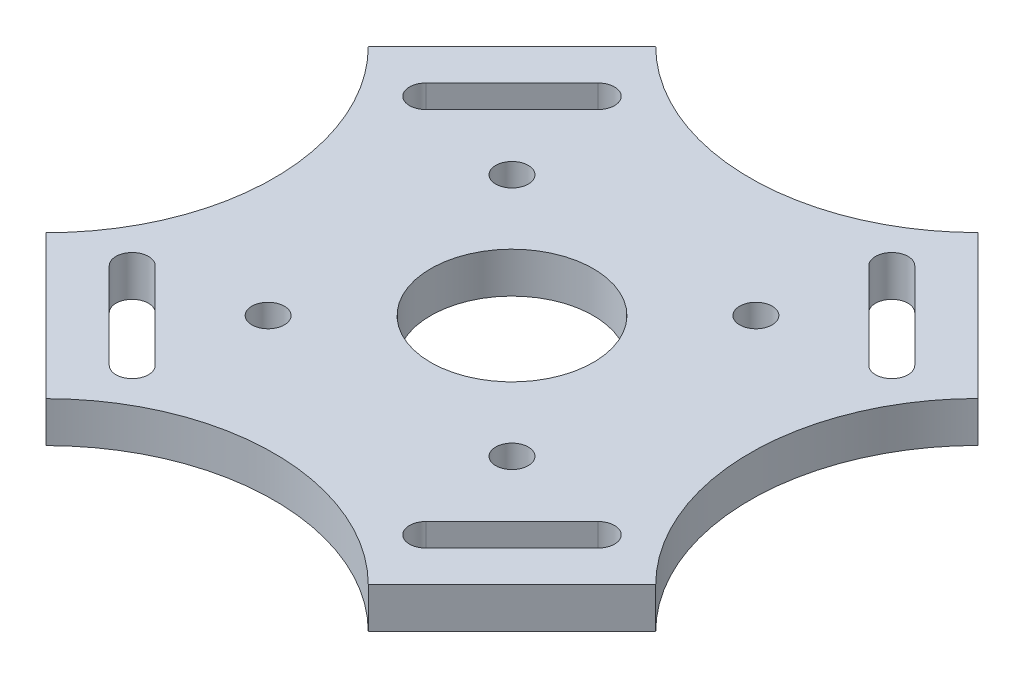
ISO-10303-21;
HEADER;
FILE_DESCRIPTION(('STEP AP214'),'2;1');
FILE_NAME('part.step','',(''),(''),'','','');
FILE_SCHEMA(('AUTOMOTIVE_DESIGN { 1 0 10303 214 1 1 1 1 }'));
ENDSEC;
DATA;
#1=APPLICATION_CONTEXT('core data for automotive mechanical design processes');
#2=APPLICATION_PROTOCOL_DEFINITION('international standard','automotive_design',2000,#1);
#3=PRODUCT_CONTEXT('',#1,'mechanical');
#4=PRODUCT('Part','Part','',(#3));
#5=PRODUCT_RELATED_PRODUCT_CATEGORY('part','',(#4));
#6=PRODUCT_DEFINITION_FORMATION('','',#4);
#7=PRODUCT_DEFINITION_CONTEXT('part definition',#1,'design');
#8=PRODUCT_DEFINITION('design','',#6,#7);
#9=PRODUCT_DEFINITION_SHAPE('','',#8);
#10=(LENGTH_UNIT() NAMED_UNIT(*) SI_UNIT(.MILLI.,.METRE.));
#11=(NAMED_UNIT(*) PLANE_ANGLE_UNIT() SI_UNIT($,.RADIAN.));
#12=(NAMED_UNIT(*) SI_UNIT($,.STERADIAN.) SOLID_ANGLE_UNIT());
#13=UNCERTAINTY_MEASURE_WITH_UNIT(LENGTH_MEASURE(1.E-05),#10,'distance_accuracy_value','');
#14=(GEOMETRIC_REPRESENTATION_CONTEXT(3) GLOBAL_UNCERTAINTY_ASSIGNED_CONTEXT((#13)) GLOBAL_UNIT_ASSIGNED_CONTEXT((#10,
#11,#12)) REPRESENTATION_CONTEXT('',''));
#15=CARTESIAN_POINT('',(0.,0.,0.));
#16=DIRECTION('',(0.,0.,1.));
#17=DIRECTION('',(1.,0.,0.));
#18=AXIS2_PLACEMENT_3D('',#15,#16,#17);
#19=CARTESIAN_POINT('',(-1.03812837674382,5.,-61.3756515884704));
#20=DIRECTION('',(0.,1.,0.));
#21=DIRECTION('',(0.,0.,1.));
#22=AXIS2_PLACEMENT_3D('',#19,#20,#21);
#23=PLANE('',#22);
#24=CARTESIAN_POINT('',(13.9618716232563,5.,-19.0533211181344));
#25=DIRECTION('',(0.,1.,0.));
#26=DIRECTION('',(0.,0.,1.));
#27=AXIS2_PLACEMENT_3D('',#24,#25,#26);
#28=CIRCLE('',#27,2.);
#29=CARTESIAN_POINT('',(13.9618716232563,5.,-17.0533211181344));
#30=VERTEX_POINT('',#29);
#31=EDGE_CURVE('E637',#30,#30,#28,.T.);
#32=ORIENTED_EDGE('',*,*,#31,.F.);
#33=EDGE_LOOP('',(#32));
#34=FACE_BOUND('',#33,.T.);
#35=CARTESIAN_POINT('',(-16.0381283767437,5.,-19.0533211181344));
#36=DIRECTION('',(0.,1.,0.));
#37=DIRECTION('',(0.,0.,1.));
#38=AXIS2_PLACEMENT_3D('',#35,#36,#37);
#39=CIRCLE('',#38,2.);
#40=CARTESIAN_POINT('',(-16.0381283767437,5.,-17.0533211181344));
#41=VERTEX_POINT('',#40);
#42=EDGE_CURVE('E236',#41,#41,#39,.T.);
#43=ORIENTED_EDGE('',*,*,#42,.F.);
#44=EDGE_LOOP('',(#43));
#45=FACE_BOUND('',#44,.T.);
#46=DIRECTION('',(-0.707106781186547,0.,0.707106781186548));
#47=VECTOR('',#46,1.);
#48=CARTESIAN_POINT('',(-20.5069054564814,5.,-34.1286999156747));
#49=LINE('',#48,#47);
#50=CARTESIAN_POINT('',(-20.5069054564814,5.,-34.1286999156747));
#51=VERTEX_POINT('',#50);
#52=CARTESIAN_POINT('',(-31.1135071742797,5.,-23.5220981978765));
#53=VERTEX_POINT('',#52);
#54=EDGE_CURVE('E349',#51,#53,#49,.T.);
#55=ORIENTED_EDGE('',*,*,#54,.F.);
#56=CARTESIAN_POINT('',(-19.0926918941084,5.,-32.7144863533016));
#57=DIRECTION('',(0.,1.,0.));
#58=DIRECTION('',(0.,0.,1.));
#59=AXIS2_PLACEMENT_3D('',#56,#57,#58);
#60=CIRCLE('',#59,2.00000000000001);
#61=CARTESIAN_POINT('',(-17.6784783317352,5.,-31.3002727909285));
#62=VERTEX_POINT('',#61);
#63=EDGE_CURVE('E346',#62,#51,#60,.T.);
#64=ORIENTED_EDGE('',*,*,#63,.F.);
#65=DIRECTION('',(0.707106781186547,0.,-0.707106781186548));
#66=VECTOR('',#65,1.);
#67=CARTESIAN_POINT('',(-17.6784783317352,5.,-31.3002727909285));
#68=LINE('',#67,#66);
#69=CARTESIAN_POINT('',(-28.2850800495335,5.,-20.6936710731303));
#70=VERTEX_POINT('',#69);
#71=EDGE_CURVE('E357',#70,#62,#68,.T.);
#72=ORIENTED_EDGE('',*,*,#71,.F.);
#73=CARTESIAN_POINT('',(-29.6992936119066,5.,-22.1078846355034));
#74=DIRECTION('',(0.,1.,0.));
#75=DIRECTION('',(0.,0.,1.));
#76=AXIS2_PLACEMENT_3D('',#73,#74,#75);
#77=CIRCLE('',#76,2.00000000000001);
#78=EDGE_CURVE('E353',#53,#70,#77,.T.);
#79=ORIENTED_EDGE('',*,*,#78,.F.);
#80=EDGE_LOOP('',(#55,#64,#72,#79));
#81=FACE_BOUND('',#80,.T.);
#82=CARTESIAN_POINT('',(-1.03812837674382,5.,-61.3756515884704));
#83=DIRECTION('',(0.,-1.,0.));
#84=DIRECTION('',(0.,0.,1.));
#85=AXIS2_PLACEMENT_3D('',#82,#83,#84);
#86=CIRCLE('',#85,28.0330085889877);
#87=CARTESIAN_POINT('',(18.7842020935914,5.,-41.5533211181378));
#88=VERTEX_POINT('',#87);
#89=CARTESIAN_POINT('',(-20.8604588470747,5.,-41.5533211181334));
#90=VERTEX_POINT('',#89);
#91=EDGE_CURVE('E389',#88,#90,#86,.T.);
#92=ORIENTED_EDGE('',*,*,#91,.T.);
#93=DIRECTION('',(-0.707106781186548,0.,0.707106781186547));
#94=VECTOR('',#93,1.);
#95=CARTESIAN_POINT('',(-38.5381283767384,5.,-23.8756515884697));
#96=LINE('',#95,#94);
#97=CARTESIAN_POINT('',(-38.5381283767384,5.,-23.8756515884697));
#98=VERTEX_POINT('',#97);
#99=EDGE_CURVE('E393',#90,#98,#96,.T.);
#100=ORIENTED_EDGE('',*,*,#99,.T.);
#101=CARTESIAN_POINT('',(-58.3441734218173,5.,-4.03704906150618));
#102=DIRECTION('',(0.,-1.,0.));
#103=DIRECTION('',(0.,0.,1.));
#104=AXIS2_PLACEMENT_3D('',#101,#102,#103);
#105=CIRCLE('',#104,28.0330085889927);
#106=CARTESIAN_POINT('',(-38.5218429514813,5.,15.7852814088328));
#107=VERTEX_POINT('',#106);
#108=EDGE_CURVE('E397',#98,#107,#105,.T.);
#109=ORIENTED_EDGE('',*,*,#108,.T.);
#110=DIRECTION('',(0.707106781186548,0.,0.707106781186547));
#111=VECTOR('',#110,1.);
#112=CARTESIAN_POINT('',(-20.8441734218177,5.,33.4629509384965));
#113=LINE('',#112,#111);
#114=CARTESIAN_POINT('',(-20.8441734218177,5.,33.4629509384965));
#115=VERTEX_POINT('',#114);
#116=EDGE_CURVE('E400',#107,#115,#113,.T.);
#117=ORIENTED_EDGE('',*,*,#116,.T.);
#118=CARTESIAN_POINT('',(-1.02184295148293,5.,53.2852814088336));
#119=DIRECTION('',(0.,-1.,0.));
#120=DIRECTION('',(0.,0.,-1.));
#121=AXIS2_PLACEMENT_3D('',#118,#119,#120);
#122=CIRCLE('',#121,28.0330085889906);
#123=CARTESIAN_POINT('',(18.7842020935875,5.,33.4466788818645));
#124=VERTEX_POINT('',#123);
#125=EDGE_CURVE('E403',#115,#124,#122,.T.);
#126=ORIENTED_EDGE('',*,*,#125,.T.);
#127=DIRECTION('',(0.70710678118655,0.,-0.707106781186546));
#128=VECTOR('',#127,1.);
#129=CARTESIAN_POINT('',(36.4618716232511,5.,15.7690093522009));
#130=LINE('',#129,#128);
#131=CARTESIAN_POINT('',(36.4618716232511,5.,15.7690093522009));
#132=VERTEX_POINT('',#131);
#133=EDGE_CURVE('E406',#124,#132,#130,.T.);
#134=ORIENTED_EDGE('',*,*,#133,.T.);
#135=CARTESIAN_POINT('',(56.2842020935884,5.,-4.05332111812981));
#136=DIRECTION('',(0.,-1.,0.));
#137=DIRECTION('',(0.,0.,1.));
#138=AXIS2_PLACEMENT_3D('',#135,#136,#137);
#139=CIRCLE('',#138,28.0330085889878);
#140=CARTESIAN_POINT('',(36.4618716232599,5.,-23.8756515884693));
#141=VERTEX_POINT('',#140);
#142=EDGE_CURVE('E409',#132,#141,#139,.T.);
#143=ORIENTED_EDGE('',*,*,#142,.T.);
#144=DIRECTION('',(-0.707106781186548,0.,-0.707106781186547));
#145=VECTOR('',#144,1.);
#146=CARTESIAN_POINT('',(18.7842020935914,5.,-41.5533211181378));
#147=LINE('',#146,#145);
#148=EDGE_CURVE('E412',#141,#88,#147,.T.);
#149=ORIENTED_EDGE('',*,*,#148,.T.);
#150=EDGE_LOOP('',(#92,#100,#109,#117,#126,#134,#143,#149));
#151=FACE_BOUND('',#150,.T.);
#152=CARTESIAN_POINT('',(-1.03812837674365,5.,-4.0533211181344));
#153=DIRECTION('',(0.,1.,0.));
#154=DIRECTION('',(0.,0.,1.));
#155=AXIS2_PLACEMENT_3D('',#152,#153,#154);
#156=CIRCLE('',#155,10.);
#157=CARTESIAN_POINT('',(-1.03812837674365,5.,5.9466788818656));
#158=VERTEX_POINT('',#157);
#159=EDGE_CURVE('E338',#158,#158,#156,.T.);
#160=ORIENTED_EDGE('',*,*,#159,.F.);
#161=EDGE_LOOP('',(#160));
#162=FACE_BOUND('',#161,.T.);
#163=DIRECTION('',(-0.707106781186545,0.,-0.70710678118655));
#164=VECTOR('',#163,1.);
#165=CARTESIAN_POINT('',(29.0372504207969,5.,-23.5220981978727));
#166=LINE('',#165,#164);
#167=CARTESIAN_POINT('',(29.0372504207969,5.,-23.5220981978727));
#168=VERTEX_POINT('',#167);
#169=CARTESIAN_POINT('',(18.4306487029987,5.,-34.128699915671));
#170=VERTEX_POINT('',#169);
#171=EDGE_CURVE('E298',#168,#170,#166,.T.);
#172=ORIENTED_EDGE('',*,*,#171,.F.);
#173=CARTESIAN_POINT('',(27.6230368584237,5.,-22.1078846354996));
#174=DIRECTION('',(0.,1.,0.));
#175=DIRECTION('',(0.,0.,1.));
#176=AXIS2_PLACEMENT_3D('',#173,#174,#175);
#177=CIRCLE('',#176,2.);
#178=CARTESIAN_POINT('',(26.2088232960507,5.,-20.6936710731265));
#179=VERTEX_POINT('',#178);
#180=EDGE_CURVE('E295',#179,#168,#177,.T.);
#181=ORIENTED_EDGE('',*,*,#180,.F.);
#182=DIRECTION('',(0.707106781186545,0.,0.70710678118655));
#183=VECTOR('',#182,1.);
#184=CARTESIAN_POINT('',(26.2088232960507,5.,-20.6936710731265));
#185=LINE('',#184,#183);
#186=CARTESIAN_POINT('',(15.6022215782525,5.,-31.3002727909248));
#187=VERTEX_POINT('',#186);
#188=EDGE_CURVE('E306',#187,#179,#185,.T.);
#189=ORIENTED_EDGE('',*,*,#188,.F.);
#190=CARTESIAN_POINT('',(17.0164351406256,5.,-32.7144863532979));
#191=DIRECTION('',(0.,1.,0.));
#192=DIRECTION('',(0.,0.,1.));
#193=AXIS2_PLACEMENT_3D('',#190,#191,#192);
#194=CIRCLE('',#193,2.00000000000001);
#195=EDGE_CURVE('E302',#170,#187,#194,.T.);
#196=ORIENTED_EDGE('',*,*,#195,.F.);
#197=EDGE_LOOP('',(#172,#181,#189,#196));
#198=FACE_BOUND('',#197,.T.);
#199=DIRECTION('',(0.707106781186552,0.,-0.707106781186543));
#200=VECTOR('',#199,1.);
#201=CARTESIAN_POINT('',(18.4306487029947,5.,26.0220576794056));
#202=LINE('',#201,#200);
#203=CARTESIAN_POINT('',(18.4306487029947,5.,26.0220576794056));
#204=VERTEX_POINT('',#203);
#205=CARTESIAN_POINT('',(29.037250420793,5.,15.4154559616074));
#206=VERTEX_POINT('',#205);
#207=EDGE_CURVE('E255',#204,#206,#202,.T.);
#208=ORIENTED_EDGE('',*,*,#207,.F.);
#209=CARTESIAN_POINT('',(17.0164351406216,5.,24.6078441170324));
#210=DIRECTION('',(0.,1.,0.));
#211=DIRECTION('',(0.,0.,1.));
#212=AXIS2_PLACEMENT_3D('',#209,#210,#211);
#213=CIRCLE('',#212,2.00000000000001);
#214=CARTESIAN_POINT('',(15.6022215782485,5.,23.1936305546594));
#215=VERTEX_POINT('',#214);
#216=EDGE_CURVE('E252',#215,#204,#213,.T.);
#217=ORIENTED_EDGE('',*,*,#216,.F.);
#218=DIRECTION('',(-0.707106781186552,0.,0.707106781186543));
#219=VECTOR('',#218,1.);
#220=CARTESIAN_POINT('',(15.6022215782485,5.,23.1936305546594));
#221=LINE('',#220,#219);
#222=CARTESIAN_POINT('',(26.2088232960468,5.,12.5870288368612));
#223=VERTEX_POINT('',#222);
#224=EDGE_CURVE('E263',#223,#215,#221,.T.);
#225=ORIENTED_EDGE('',*,*,#224,.F.);
#226=CARTESIAN_POINT('',(27.6230368584199,5.,14.0012423992343));
#227=DIRECTION('',(0.,1.,0.));
#228=DIRECTION('',(0.,0.,1.));
#229=AXIS2_PLACEMENT_3D('',#226,#227,#228);
#230=CIRCLE('',#229,2.00000000000001);
#231=EDGE_CURVE('E259',#206,#223,#230,.T.);
#232=ORIENTED_EDGE('',*,*,#231,.F.);
#233=EDGE_LOOP('',(#208,#217,#225,#232));
#234=FACE_BOUND('',#233,.T.);
#235=DIRECTION('',(0.70710678118654,0.,0.707106781186555));
#236=VECTOR('',#235,1.);
#237=CARTESIAN_POINT('',(-31.1135071742835,5.,15.4154559616032));
#238=LINE('',#237,#236);
#239=CARTESIAN_POINT('',(-31.1135071742835,5.,15.4154559616032));
#240=VERTEX_POINT('',#239);
#241=CARTESIAN_POINT('',(-20.5069054564854,5.,26.0220576794016));
#242=VERTEX_POINT('',#241);
#243=EDGE_CURVE('E210',#240,#242,#238,.T.);
#244=ORIENTED_EDGE('',*,*,#243,.F.);
#245=CARTESIAN_POINT('',(-29.6992936119104,5.,14.0012423992302));
#246=DIRECTION('',(0.,1.,0.));
#247=DIRECTION('',(0.,0.,1.));
#248=AXIS2_PLACEMENT_3D('',#245,#246,#247);
#249=CIRCLE('',#248,2.);
#250=CARTESIAN_POINT('',(-28.2850800495373,5.,12.5870288368571));
#251=VERTEX_POINT('',#250);
#252=EDGE_CURVE('E201',#251,#240,#249,.T.);
#253=ORIENTED_EDGE('',*,*,#252,.F.);
#254=DIRECTION('',(-0.70710678118654,0.,-0.707106781186555));
#255=VECTOR('',#254,1.);
#256=CARTESIAN_POINT('',(-28.2850800495373,5.,12.5870288368571));
#257=LINE('',#256,#255);
#258=CARTESIAN_POINT('',(-17.6784783317392,5.,23.1936305546554));
#259=VERTEX_POINT('',#258);
#260=EDGE_CURVE('E228',#259,#251,#257,.T.);
#261=ORIENTED_EDGE('',*,*,#260,.F.);
#262=CARTESIAN_POINT('',(-19.0926918941123,5.,24.6078441170285));
#263=DIRECTION('',(0.,1.,0.));
#264=DIRECTION('',(0.,0.,1.));
#265=AXIS2_PLACEMENT_3D('',#262,#263,#264);
#266=CIRCLE('',#265,2.00000000000001);
#267=EDGE_CURVE('E224',#242,#259,#266,.T.);
#268=ORIENTED_EDGE('',*,*,#267,.F.);
#269=EDGE_LOOP('',(#244,#253,#261,#268));
#270=FACE_BOUND('',#269,.T.);
#271=CARTESIAN_POINT('',(13.9618716232563,5.,10.9466788818656));
#272=DIRECTION('',(0.,1.,0.));
#273=DIRECTION('',(0.,0.,1.));
#274=AXIS2_PLACEMENT_3D('',#271,#272,#273);
#275=CIRCLE('',#274,2.);
#276=CARTESIAN_POINT('',(13.9618716232563,5.,12.9466788818656));
#277=VERTEX_POINT('',#276);
#278=EDGE_CURVE('E645',#277,#277,#275,.T.);
#279=ORIENTED_EDGE('',*,*,#278,.F.);
#280=EDGE_LOOP('',(#279));
#281=FACE_BOUND('',#280,.T.);
#282=CARTESIAN_POINT('',(-16.0381283767437,5.,10.9466788818656));
#283=DIRECTION('',(0.,1.,0.));
#284=DIRECTION('',(0.,0.,1.));
#285=AXIS2_PLACEMENT_3D('',#282,#283,#284);
#286=CIRCLE('',#285,2.);
#287=CARTESIAN_POINT('',(-16.0381283767437,5.,12.9466788818656));
#288=VERTEX_POINT('',#287);
#289=EDGE_CURVE('E626',#288,#288,#286,.T.);
#290=ORIENTED_EDGE('',*,*,#289,.F.);
#291=EDGE_LOOP('',(#290));
#292=FACE_BOUND('',#291,.T.);
#293=ADVANCED_FACE('F39',(#34,#45,#81,#151,#162,#198,#234,#270,#281,#292),#23,.T.);
#294=CARTESIAN_POINT('',(-1.03812837674382,0.,-61.3756515884704));
#295=DIRECTION('',(0.,1.,0.));
#296=DIRECTION('',(0.,0.,1.));
#297=AXIS2_PLACEMENT_3D('',#294,#295,#296);
#298=PLANE('',#297);
#299=CARTESIAN_POINT('',(17.0164351406216,0.,24.6078441170324));
#300=DIRECTION('',(0.,1.,0.));
#301=DIRECTION('',(0.,0.,1.));
#302=AXIS2_PLACEMENT_3D('',#299,#300,#301);
#303=CIRCLE('',#302,2.00000000000001);
#304=CARTESIAN_POINT('',(15.6022215782485,0.,23.1936305546593));
#305=VERTEX_POINT('',#304);
#306=CARTESIAN_POINT('',(18.4306487029947,0.,26.0220576794056));
#307=VERTEX_POINT('',#306);
#308=EDGE_CURVE('E219',#305,#307,#303,.T.);
#309=ORIENTED_EDGE('',*,*,#308,.T.);
#310=DIRECTION('',(0.707106781186552,0.,-0.707106781186543));
#311=VECTOR('',#310,1.);
#312=CARTESIAN_POINT('',(18.4306487029947,0.,26.0220576794056));
#313=LINE('',#312,#311);
#314=CARTESIAN_POINT('',(29.037250420793,0.,15.4154559616074));
#315=VERTEX_POINT('',#314);
#316=EDGE_CURVE('E270',#307,#315,#313,.T.);
#317=ORIENTED_EDGE('',*,*,#316,.T.);
#318=CARTESIAN_POINT('',(27.6230368584199,0.,14.0012423992343));
#319=DIRECTION('',(0.,1.,0.));
#320=DIRECTION('',(0.,0.,1.));
#321=AXIS2_PLACEMENT_3D('',#318,#319,#320);
#322=CIRCLE('',#321,2.00000000000001);
#323=CARTESIAN_POINT('',(26.2088232960468,0.,12.5870288368612));
#324=VERTEX_POINT('',#323);
#325=EDGE_CURVE('E274',#315,#324,#322,.T.);
#326=ORIENTED_EDGE('',*,*,#325,.T.);
#327=DIRECTION('',(-0.707106781186552,0.,0.707106781186543));
#328=VECTOR('',#327,1.);
#329=CARTESIAN_POINT('',(15.6022215782485,0.,23.1936305546594));
#330=LINE('',#329,#328);
#331=EDGE_CURVE('E256',#324,#305,#330,.T.);
#332=ORIENTED_EDGE('',*,*,#331,.T.);
#333=EDGE_LOOP('',(#309,#317,#326,#332));
#334=FACE_BOUND('',#333,.T.);
#335=CARTESIAN_POINT('',(-1.03812837674365,0.,-4.0533211181344));
#336=DIRECTION('',(0.,1.,0.));
#337=DIRECTION('',(0.,0.,1.));
#338=AXIS2_PLACEMENT_3D('',#335,#336,#337);
#339=CIRCLE('',#338,10.);
#340=CARTESIAN_POINT('',(-1.03812837674365,0.,5.9466788818656));
#341=VERTEX_POINT('',#340);
#342=EDGE_CURVE('E337',#341,#341,#339,.T.);
#343=ORIENTED_EDGE('',*,*,#342,.T.);
#344=EDGE_LOOP('',(#343));
#345=FACE_BOUND('',#344,.T.);
#346=CARTESIAN_POINT('',(-19.0926918941084,0.,-32.7144863533016));
#347=DIRECTION('',(0.,1.,0.));
#348=DIRECTION('',(0.,0.,1.));
#349=AXIS2_PLACEMENT_3D('',#346,#347,#348);
#350=CIRCLE('',#349,2.00000000000001);
#351=CARTESIAN_POINT('',(-17.6784783317352,0.,-31.3002727909285));
#352=VERTEX_POINT('',#351);
#353=CARTESIAN_POINT('',(-20.5069054564814,0.,-34.1286999156747));
#354=VERTEX_POINT('',#353);
#355=EDGE_CURVE('E342',#352,#354,#350,.T.);
#356=ORIENTED_EDGE('',*,*,#355,.T.);
#357=DIRECTION('',(-0.707106781186547,0.,0.707106781186548));
#358=VECTOR('',#357,1.);
#359=CARTESIAN_POINT('',(-20.5069054564814,0.,-34.1286999156747));
#360=LINE('',#359,#358);
#361=CARTESIAN_POINT('',(-31.1135071742797,0.,-23.5220981978765));
#362=VERTEX_POINT('',#361);
#363=EDGE_CURVE('E364',#354,#362,#360,.T.);
#364=ORIENTED_EDGE('',*,*,#363,.T.);
#365=CARTESIAN_POINT('',(-29.6992936119066,0.,-22.1078846355034));
#366=DIRECTION('',(0.,1.,0.));
#367=DIRECTION('',(0.,0.,1.));
#368=AXIS2_PLACEMENT_3D('',#365,#366,#367);
#369=CIRCLE('',#368,2.00000000000001);
#370=CARTESIAN_POINT('',(-28.2850800495335,0.,-20.6936710731303));
#371=VERTEX_POINT('',#370);
#372=EDGE_CURVE('E368',#362,#371,#369,.T.);
#373=ORIENTED_EDGE('',*,*,#372,.T.);
#374=DIRECTION('',(0.707106781186547,0.,-0.707106781186548));
#375=VECTOR('',#374,1.);
#376=CARTESIAN_POINT('',(-17.6784783317352,0.,-31.3002727909285));
#377=LINE('',#376,#375);
#378=EDGE_CURVE('E350',#371,#352,#377,.T.);
#379=ORIENTED_EDGE('',*,*,#378,.T.);
#380=EDGE_LOOP('',(#356,#364,#373,#379));
#381=FACE_BOUND('',#380,.T.);
#382=CARTESIAN_POINT('',(-1.03812837674382,0.,-61.3756515884704));
#383=DIRECTION('',(0.,-1.,0.));
#384=DIRECTION('',(0.,0.,1.));
#385=AXIS2_PLACEMENT_3D('',#382,#383,#384);
#386=CIRCLE('',#385,28.0330085889877);
#387=CARTESIAN_POINT('',(18.7842020935914,0.,-41.5533211181378));
#388=VERTEX_POINT('',#387);
#389=CARTESIAN_POINT('',(-20.8604588470747,0.,-41.5533211181334));
#390=VERTEX_POINT('',#389);
#391=EDGE_CURVE('E388',#388,#390,#386,.T.);
#392=ORIENTED_EDGE('',*,*,#391,.F.);
#393=DIRECTION('',(-0.707106781186548,0.,-0.707106781186547));
#394=VECTOR('',#393,1.);
#395=CARTESIAN_POINT('',(18.7842020935914,0.,-41.5533211181378));
#396=LINE('',#395,#394);
#397=CARTESIAN_POINT('',(36.4618716232599,0.,-23.8756515884693));
#398=VERTEX_POINT('',#397);
#399=EDGE_CURVE('E394',#398,#388,#396,.T.);
#400=ORIENTED_EDGE('',*,*,#399,.F.);
#401=CARTESIAN_POINT('',(56.2842020935884,0.,-4.05332111812981));
#402=DIRECTION('',(0.,-1.,0.));
#403=DIRECTION('',(0.,0.,1.));
#404=AXIS2_PLACEMENT_3D('',#401,#402,#403);
#405=CIRCLE('',#404,28.0330085889878);
#406=CARTESIAN_POINT('',(36.4618716232511,0.,15.7690093522009));
#407=VERTEX_POINT('',#406);
#408=EDGE_CURVE('E434',#407,#398,#405,.T.);
#409=ORIENTED_EDGE('',*,*,#408,.F.);
#410=DIRECTION('',(0.70710678118655,0.,-0.707106781186546));
#411=VECTOR('',#410,1.);
#412=CARTESIAN_POINT('',(36.4618716232511,0.,15.7690093522009));
#413=LINE('',#412,#411);
#414=CARTESIAN_POINT('',(18.7842020935875,0.,33.4466788818645));
#415=VERTEX_POINT('',#414);
#416=EDGE_CURVE('E431',#415,#407,#413,.T.);
#417=ORIENTED_EDGE('',*,*,#416,.F.);
#418=CARTESIAN_POINT('',(-1.02184295148293,0.,53.2852814088336));
#419=DIRECTION('',(0.,-1.,0.));
#420=DIRECTION('',(0.,0.,-1.));
#421=AXIS2_PLACEMENT_3D('',#418,#419,#420);
#422=CIRCLE('',#421,28.0330085889906);
#423=CARTESIAN_POINT('',(-20.8441734218177,0.,33.4629509384965));
#424=VERTEX_POINT('',#423);
#425=EDGE_CURVE('E428',#424,#415,#422,.T.);
#426=ORIENTED_EDGE('',*,*,#425,.F.);
#427=DIRECTION('',(0.707106781186548,0.,0.707106781186547));
#428=VECTOR('',#427,1.);
#429=CARTESIAN_POINT('',(-20.8441734218177,0.,33.4629509384965));
#430=LINE('',#429,#428);
#431=CARTESIAN_POINT('',(-38.5218429514813,0.,15.7852814088328));
#432=VERTEX_POINT('',#431);
#433=EDGE_CURVE('E425',#432,#424,#430,.T.);
#434=ORIENTED_EDGE('',*,*,#433,.F.);
#435=CARTESIAN_POINT('',(-58.3441734218173,0.,-4.03704906150618));
#436=DIRECTION('',(0.,-1.,0.));
#437=DIRECTION('',(0.,0.,1.));
#438=AXIS2_PLACEMENT_3D('',#435,#436,#437);
#439=CIRCLE('',#438,28.0330085889927);
#440=CARTESIAN_POINT('',(-38.5381283767384,0.,-23.8756515884697));
#441=VERTEX_POINT('',#440);
#442=EDGE_CURVE('E422',#441,#432,#439,.T.);
#443=ORIENTED_EDGE('',*,*,#442,.F.);
#444=DIRECTION('',(-0.707106781186548,0.,0.707106781186547));
#445=VECTOR('',#444,1.);
#446=CARTESIAN_POINT('',(-38.5381283767384,0.,-23.8756515884697));
#447=LINE('',#446,#445);
#448=EDGE_CURVE('E419',#390,#441,#447,.T.);
#449=ORIENTED_EDGE('',*,*,#448,.F.);
#450=EDGE_LOOP('',(#392,#400,#409,#417,#426,#434,#443,#449));
#451=FACE_BOUND('',#450,.T.);
#452=CARTESIAN_POINT('',(27.6230368584237,0.,-22.1078846354996));
#453=DIRECTION('',(0.,1.,0.));
#454=DIRECTION('',(0.,0.,1.));
#455=AXIS2_PLACEMENT_3D('',#452,#453,#454);
#456=CIRCLE('',#455,2.);
#457=CARTESIAN_POINT('',(26.2088232960507,0.,-20.6936710731265));
#458=VERTEX_POINT('',#457);
#459=CARTESIAN_POINT('',(29.0372504207969,0.,-23.5220981978727));
#460=VERTEX_POINT('',#459);
#461=EDGE_CURVE('E294',#458,#460,#456,.T.);
#462=ORIENTED_EDGE('',*,*,#461,.T.);
#463=DIRECTION('',(-0.707106781186545,0.,-0.70710678118655));
#464=VECTOR('',#463,1.);
#465=CARTESIAN_POINT('',(29.0372504207969,0.,-23.5220981978727));
#466=LINE('',#465,#464);
#467=CARTESIAN_POINT('',(18.4306487029987,0.,-34.128699915671));
#468=VERTEX_POINT('',#467);
#469=EDGE_CURVE('E313',#460,#468,#466,.T.);
#470=ORIENTED_EDGE('',*,*,#469,.T.);
#471=CARTESIAN_POINT('',(17.0164351406256,0.,-32.7144863532979));
#472=DIRECTION('',(0.,1.,0.));
#473=DIRECTION('',(0.,0.,1.));
#474=AXIS2_PLACEMENT_3D('',#471,#472,#473);
#475=CIRCLE('',#474,2.00000000000001);
#476=CARTESIAN_POINT('',(15.6022215782525,0.,-31.3002727909248));
#477=VERTEX_POINT('',#476);
#478=EDGE_CURVE('E317',#468,#477,#475,.T.);
#479=ORIENTED_EDGE('',*,*,#478,.T.);
#480=DIRECTION('',(0.707106781186545,0.,0.70710678118655));
#481=VECTOR('',#480,1.);
#482=CARTESIAN_POINT('',(26.2088232960507,0.,-20.6936710731265));
#483=LINE('',#482,#481);
#484=EDGE_CURVE('E299',#477,#458,#483,.T.);
#485=ORIENTED_EDGE('',*,*,#484,.T.);
#486=EDGE_LOOP('',(#462,#470,#479,#485));
#487=FACE_BOUND('',#486,.T.);
#488=CARTESIAN_POINT('',(-29.6992936119104,0.,14.0012423992302));
#489=DIRECTION('',(0.,1.,0.));
#490=DIRECTION('',(0.,0.,1.));
#491=AXIS2_PLACEMENT_3D('',#488,#489,#490);
#492=CIRCLE('',#491,2.);
#493=CARTESIAN_POINT('',(-28.2850800495373,0.,12.5870288368571));
#494=VERTEX_POINT('',#493);
#495=CARTESIAN_POINT('',(-31.1135071742835,0.,15.4154559616032));
#496=VERTEX_POINT('',#495);
#497=EDGE_CURVE('E63',#494,#496,#492,.T.);
#498=ORIENTED_EDGE('',*,*,#497,.T.);
#499=DIRECTION('',(0.70710678118654,0.,0.707106781186555));
#500=VECTOR('',#499,1.);
#501=CARTESIAN_POINT('',(-31.1135071742835,0.,15.4154559616032));
#502=LINE('',#501,#500);
#503=CARTESIAN_POINT('',(-20.5069054564854,0.,26.0220576794016));
#504=VERTEX_POINT('',#503);
#505=EDGE_CURVE('E217',#496,#504,#502,.T.);
#506=ORIENTED_EDGE('',*,*,#505,.T.);
#507=CARTESIAN_POINT('',(-19.0926918941123,0.,24.6078441170285));
#508=DIRECTION('',(0.,1.,0.));
#509=DIRECTION('',(0.,0.,1.));
#510=AXIS2_PLACEMENT_3D('',#507,#508,#509);
#511=CIRCLE('',#510,2.00000000000001);
#512=CARTESIAN_POINT('',(-17.6784783317392,0.,23.1936305546554));
#513=VERTEX_POINT('',#512);
#514=EDGE_CURVE('E239',#504,#513,#511,.T.);
#515=ORIENTED_EDGE('',*,*,#514,.T.);
#516=DIRECTION('',(-0.70710678118654,0.,-0.707106781186555));
#517=VECTOR('',#516,1.);
#518=CARTESIAN_POINT('',(-28.2850800495373,0.,12.5870288368571));
#519=LINE('',#518,#517);
#520=EDGE_CURVE('E211',#513,#494,#519,.T.);
#521=ORIENTED_EDGE('',*,*,#520,.T.);
#522=EDGE_LOOP('',(#498,#506,#515,#521));
#523=FACE_BOUND('',#522,.T.);
#524=CARTESIAN_POINT('',(-16.0381283767437,0.,-19.0533211181344));
#525=DIRECTION('',(0.,1.,0.));
#526=DIRECTION('',(0.,0.,1.));
#527=AXIS2_PLACEMENT_3D('',#524,#525,#526);
#528=CIRCLE('',#527,2.);
#529=CARTESIAN_POINT('',(-16.0381283767437,0.,-17.0533211181344));
#530=VERTEX_POINT('',#529);
#531=EDGE_CURVE('E649',#530,#530,#528,.T.);
#532=ORIENTED_EDGE('',*,*,#531,.T.);
#533=EDGE_LOOP('',(#532));
#534=FACE_BOUND('',#533,.T.);
#535=CARTESIAN_POINT('',(13.9618716232563,0.,10.9466788818656));
#536=DIRECTION('',(0.,1.,0.));
#537=DIRECTION('',(0.,0.,1.));
#538=AXIS2_PLACEMENT_3D('',#535,#536,#537);
#539=CIRCLE('',#538,2.);
#540=CARTESIAN_POINT('',(13.9618716232563,0.,12.9466788818656));
#541=VERTEX_POINT('',#540);
#542=EDGE_CURVE('E641',#541,#541,#539,.T.);
#543=ORIENTED_EDGE('',*,*,#542,.T.);
#544=EDGE_LOOP('',(#543));
#545=FACE_BOUND('',#544,.T.);
#546=CARTESIAN_POINT('',(13.9618716232563,0.,-19.0533211181344));
#547=DIRECTION('',(0.,1.,0.));
#548=DIRECTION('',(0.,0.,1.));
#549=AXIS2_PLACEMENT_3D('',#546,#547,#548);
#550=CIRCLE('',#549,2.);
#551=CARTESIAN_POINT('',(13.9618716232563,0.,-17.0533211181344));
#552=VERTEX_POINT('',#551);
#553=EDGE_CURVE('E634',#552,#552,#550,.T.);
#554=ORIENTED_EDGE('',*,*,#553,.T.);
#555=EDGE_LOOP('',(#554));
#556=FACE_BOUND('',#555,.T.);
#557=CARTESIAN_POINT('',(-16.0381283767437,0.,10.9466788818656));
#558=DIRECTION('',(0.,1.,0.));
#559=DIRECTION('',(0.,0.,1.));
#560=AXIS2_PLACEMENT_3D('',#557,#558,#559);
#561=CIRCLE('',#560,2.);
#562=CARTESIAN_POINT('',(-16.0381283767437,0.,12.9466788818656));
#563=VERTEX_POINT('',#562);
#564=EDGE_CURVE('E629',#563,#563,#561,.T.);
#565=ORIENTED_EDGE('',*,*,#564,.T.);
#566=EDGE_LOOP('',(#565));
#567=FACE_BOUND('',#566,.T.);
#568=ADVANCED_FACE('F473',(#334,#345,#381,#451,#487,#523,#534,#545,#556,#567),#298,.F.);
#569=CARTESIAN_POINT('',(-1.03812837674382,5.,-61.3756515884704));
#570=DIRECTION('',(0.,-1.,0.));
#571=DIRECTION('',(0.,0.,-1.));
#572=AXIS2_PLACEMENT_3D('',#569,#570,#571);
#573=CYLINDRICAL_SURFACE('',#572,28.0330085889877);
#574=ORIENTED_EDGE('',*,*,#391,.T.);
#575=DIRECTION('',(0.,-1.,0.));
#576=VECTOR('',#575,1.);
#577=CARTESIAN_POINT('',(-20.8604588470747,5.,-41.5533211181334));
#578=LINE('',#577,#576);
#579=EDGE_CURVE('E11',#90,#390,#578,.T.);
#580=ORIENTED_EDGE('',*,*,#579,.F.);
#581=ORIENTED_EDGE('',*,*,#91,.F.);
#582=DIRECTION('',(0.,-1.,0.));
#583=VECTOR('',#582,1.);
#584=CARTESIAN_POINT('',(18.7842020935914,5.,-41.5533211181378));
#585=LINE('',#584,#583);
#586=EDGE_CURVE('E415',#88,#388,#585,.T.);
#587=ORIENTED_EDGE('',*,*,#586,.T.);
#588=EDGE_LOOP('',(#574,#580,#581,#587));
#589=FACE_BOUND('',#588,.T.);
#590=ADVANCED_FACE('F41',(#589),#573,.F.);
#591=CARTESIAN_POINT('',(-38.5381283767384,5.,-23.8756515884697));
#592=DIRECTION('',(0.707106781186547,0.,0.707106781186548));
#593=DIRECTION('',(0.707106781186548,0.,-0.707106781186547));
#594=AXIS2_PLACEMENT_3D('',#591,#592,#593);
#595=PLANE('',#594);
#596=ORIENTED_EDGE('',*,*,#448,.T.);
#597=DIRECTION('',(0.,-1.,0.));
#598=VECTOR('',#597,1.);
#599=CARTESIAN_POINT('',(-38.5381283767384,5.,-23.8756515884697));
#600=LINE('',#599,#598);
#601=EDGE_CURVE('E48',#98,#441,#600,.T.);
#602=ORIENTED_EDGE('',*,*,#601,.F.);
#603=ORIENTED_EDGE('',*,*,#99,.F.);
#604=ORIENTED_EDGE('',*,*,#579,.T.);
#605=EDGE_LOOP('',(#596,#602,#603,#604));
#606=FACE_BOUND('',#605,.T.);
#607=ADVANCED_FACE('F491',(#606),#595,.F.);
#608=CARTESIAN_POINT('',(-58.3441734218173,5.,-4.03704906150618));
#609=DIRECTION('',(0.,-1.,0.));
#610=DIRECTION('',(0.,0.,-1.));
#611=AXIS2_PLACEMENT_3D('',#608,#609,#610);
#612=CYLINDRICAL_SURFACE('',#611,28.0330085889927);
#613=ORIENTED_EDGE('',*,*,#442,.T.);
#614=DIRECTION('',(0.,-1.,0.));
#615=VECTOR('',#614,1.);
#616=CARTESIAN_POINT('',(-38.5218429514813,5.,15.7852814088328));
#617=LINE('',#616,#615);
#618=EDGE_CURVE('E458',#107,#432,#617,.T.);
#619=ORIENTED_EDGE('',*,*,#618,.F.);
#620=ORIENTED_EDGE('',*,*,#108,.F.);
#621=ORIENTED_EDGE('',*,*,#601,.T.);
#622=EDGE_LOOP('',(#613,#619,#620,#621));
#623=FACE_BOUND('',#622,.T.);
#624=ADVANCED_FACE('F467',(#623),#612,.F.);
#625=CARTESIAN_POINT('',(-20.8441734218177,5.,33.4629509384965));
#626=DIRECTION('',(0.707106781186547,0.,-0.707106781186548));
#627=DIRECTION('',(-0.707106781186548,0.,-0.707106781186547));
#628=AXIS2_PLACEMENT_3D('',#625,#626,#627);
#629=PLANE('',#628);
#630=ORIENTED_EDGE('',*,*,#433,.T.);
#631=DIRECTION('',(0.,-1.,0.));
#632=VECTOR('',#631,1.);
#633=CARTESIAN_POINT('',(-20.8441734218177,5.,33.4629509384965));
#634=LINE('',#633,#632);
#635=EDGE_CURVE('E454',#115,#424,#634,.T.);
#636=ORIENTED_EDGE('',*,*,#635,.F.);
#637=ORIENTED_EDGE('',*,*,#116,.F.);
#638=ORIENTED_EDGE('',*,*,#618,.T.);
#639=EDGE_LOOP('',(#630,#636,#637,#638));
#640=FACE_BOUND('',#639,.T.);
#641=ADVANCED_FACE('F479',(#640),#629,.F.);
#642=CARTESIAN_POINT('',(-1.02184295148293,5.,53.2852814088336));
#643=DIRECTION('',(0.,-1.,0.));
#644=DIRECTION('',(0.,0.,-1.));
#645=AXIS2_PLACEMENT_3D('',#642,#643,#644);
#646=CYLINDRICAL_SURFACE('',#645,28.0330085889906);
#647=ORIENTED_EDGE('',*,*,#425,.T.);
#648=DIRECTION('',(0.,-1.,0.));
#649=VECTOR('',#648,1.);
#650=CARTESIAN_POINT('',(18.7842020935875,5.,33.4466788818645));
#651=LINE('',#650,#649);
#652=EDGE_CURVE('E450',#124,#415,#651,.T.);
#653=ORIENTED_EDGE('',*,*,#652,.F.);
#654=ORIENTED_EDGE('',*,*,#125,.F.);
#655=ORIENTED_EDGE('',*,*,#635,.T.);
#656=EDGE_LOOP('',(#647,#653,#654,#655));
#657=FACE_BOUND('',#656,.T.);
#658=ADVANCED_FACE('F483',(#657),#646,.F.);
#659=CARTESIAN_POINT('',(36.4618716232511,5.,15.7690093522009));
#660=DIRECTION('',(-0.707106781186546,0.,-0.70710678118655));
#661=DIRECTION('',(-0.70710678118655,0.,0.707106781186546));
#662=AXIS2_PLACEMENT_3D('',#659,#660,#661);
#663=PLANE('',#662);
#664=ORIENTED_EDGE('',*,*,#416,.T.);
#665=DIRECTION('',(0.,-1.,0.));
#666=VECTOR('',#665,1.);
#667=CARTESIAN_POINT('',(36.4618716232511,5.,15.7690093522009));
#668=LINE('',#667,#666);
#669=EDGE_CURVE('E446',#132,#407,#668,.T.);
#670=ORIENTED_EDGE('',*,*,#669,.F.);
#671=ORIENTED_EDGE('',*,*,#133,.F.);
#672=ORIENTED_EDGE('',*,*,#652,.T.);
#673=EDGE_LOOP('',(#664,#670,#671,#672));
#674=FACE_BOUND('',#673,.T.);
#675=ADVANCED_FACE('F504',(#674),#663,.F.);
#676=CARTESIAN_POINT('',(56.2842020935884,5.,-4.05332111812981));
#677=DIRECTION('',(0.,-1.,0.));
#678=DIRECTION('',(0.,0.,-1.));
#679=AXIS2_PLACEMENT_3D('',#676,#677,#678);
#680=CYLINDRICAL_SURFACE('',#679,28.0330085889878);
#681=ORIENTED_EDGE('',*,*,#408,.T.);
#682=DIRECTION('',(0.,-1.,0.));
#683=VECTOR('',#682,1.);
#684=CARTESIAN_POINT('',(36.4618716232599,5.,-23.8756515884693));
#685=LINE('',#684,#683);
#686=EDGE_CURVE('E442',#141,#398,#685,.T.);
#687=ORIENTED_EDGE('',*,*,#686,.F.);
#688=ORIENTED_EDGE('',*,*,#142,.F.);
#689=ORIENTED_EDGE('',*,*,#669,.T.);
#690=EDGE_LOOP('',(#681,#687,#688,#689));
#691=FACE_BOUND('',#690,.T.);
#692=ADVANCED_FACE('F502',(#691),#680,.F.);
#693=CARTESIAN_POINT('',(18.7842020935914,5.,-41.5533211181378));
#694=DIRECTION('',(-0.707106781186547,0.,0.707106781186548));
#695=DIRECTION('',(0.707106781186548,0.,0.707106781186547));
#696=AXIS2_PLACEMENT_3D('',#693,#694,#695);
#697=PLANE('',#696);
#698=ORIENTED_EDGE('',*,*,#399,.T.);
#699=ORIENTED_EDGE('',*,*,#586,.F.);
#700=ORIENTED_EDGE('',*,*,#148,.F.);
#701=ORIENTED_EDGE('',*,*,#686,.T.);
#702=EDGE_LOOP('',(#698,#699,#700,#701));
#703=FACE_BOUND('',#702,.T.);
#704=ADVANCED_FACE('F497',(#703),#697,.F.);
#705=CARTESIAN_POINT('',(-19.0926918941084,5.,-32.7144863533016));
#706=DIRECTION('',(0.,-1.,0.));
#707=DIRECTION('',(0.,0.,-1.));
#708=AXIS2_PLACEMENT_3D('',#705,#706,#707);
#709=CYLINDRICAL_SURFACE('',#708,2.00000000000001);
#710=ORIENTED_EDGE('',*,*,#355,.F.);
#711=DIRECTION('',(0.,-1.,0.));
#712=VECTOR('',#711,1.);
#713=CARTESIAN_POINT('',(-17.6784783317352,5.,-31.3002727909285));
#714=LINE('',#713,#712);
#715=EDGE_CURVE('E360',#62,#352,#714,.T.);
#716=ORIENTED_EDGE('',*,*,#715,.F.);
#717=ORIENTED_EDGE('',*,*,#63,.T.);
#718=DIRECTION('',(0.,-1.,0.));
#719=VECTOR('',#718,1.);
#720=CARTESIAN_POINT('',(-20.5069054564814,5.,-34.1286999156747));
#721=LINE('',#720,#719);
#722=EDGE_CURVE('E384',#51,#354,#721,.T.);
#723=ORIENTED_EDGE('',*,*,#722,.T.);
#724=EDGE_LOOP('',(#710,#716,#717,#723));
#725=FACE_BOUND('',#724,.T.);
#726=ADVANCED_FACE('F524',(#725),#709,.F.);
#727=CARTESIAN_POINT('',(-20.5069054564814,5.,-34.1286999156747));
#728=DIRECTION('',(0.707106781186548,0.,0.707106781186547));
#729=DIRECTION('',(0.707106781186547,0.,-0.707106781186548));
#730=AXIS2_PLACEMENT_3D('',#727,#728,#729);
#731=PLANE('',#730);
#732=ORIENTED_EDGE('',*,*,#363,.F.);
#733=ORIENTED_EDGE('',*,*,#722,.F.);
#734=ORIENTED_EDGE('',*,*,#54,.T.);
#735=DIRECTION('',(0.,-1.,0.));
#736=VECTOR('',#735,1.);
#737=CARTESIAN_POINT('',(-31.1135071742797,5.,-23.5220981978765));
#738=LINE('',#737,#736);
#739=EDGE_CURVE('E381',#53,#362,#738,.T.);
#740=ORIENTED_EDGE('',*,*,#739,.T.);
#741=EDGE_LOOP('',(#732,#733,#734,#740));
#742=FACE_BOUND('',#741,.T.);
#743=ADVANCED_FACE('F531',(#742),#731,.T.);
#744=CARTESIAN_POINT('',(-29.6992936119066,5.,-22.1078846355034));
#745=DIRECTION('',(0.,-1.,0.));
#746=DIRECTION('',(0.,0.,-1.));
#747=AXIS2_PLACEMENT_3D('',#744,#745,#746);
#748=CYLINDRICAL_SURFACE('',#747,2.00000000000001);
#749=ORIENTED_EDGE('',*,*,#372,.F.);
#750=ORIENTED_EDGE('',*,*,#739,.F.);
#751=ORIENTED_EDGE('',*,*,#78,.T.);
#752=DIRECTION('',(0.,-1.,0.));
#753=VECTOR('',#752,1.);
#754=CARTESIAN_POINT('',(-28.2850800495335,5.,-20.6936710731303));
#755=LINE('',#754,#753);
#756=EDGE_CURVE('E378',#70,#371,#755,.T.);
#757=ORIENTED_EDGE('',*,*,#756,.T.);
#758=EDGE_LOOP('',(#749,#750,#751,#757));
#759=FACE_BOUND('',#758,.T.);
#760=ADVANCED_FACE('F536',(#759),#748,.F.);
#761=CARTESIAN_POINT('',(-17.6784783317352,5.,-31.3002727909285));
#762=DIRECTION('',(-0.707106781186548,0.,-0.707106781186547));
#763=DIRECTION('',(-0.707106781186547,0.,0.707106781186548));
#764=AXIS2_PLACEMENT_3D('',#761,#762,#763);
#765=PLANE('',#764);
#766=ORIENTED_EDGE('',*,*,#378,.F.);
#767=ORIENTED_EDGE('',*,*,#756,.F.);
#768=ORIENTED_EDGE('',*,*,#71,.T.);
#769=ORIENTED_EDGE('',*,*,#715,.T.);
#770=EDGE_LOOP('',(#766,#767,#768,#769));
#771=FACE_BOUND('',#770,.T.);
#772=ADVANCED_FACE('F544',(#771),#765,.T.);
#773=CARTESIAN_POINT('',(-1.03812837674365,5.,-4.0533211181344));
#774=DIRECTION('',(0.,-1.,0.));
#775=DIRECTION('',(0.,0.,-1.));
#776=AXIS2_PLACEMENT_3D('',#773,#774,#775);
#777=CYLINDRICAL_SURFACE('',#776,10.);
#778=ORIENTED_EDGE('',*,*,#159,.T.);
#779=EDGE_LOOP('',(#778));
#780=FACE_BOUND('',#779,.T.);
#781=ORIENTED_EDGE('',*,*,#342,.F.);
#782=EDGE_LOOP('',(#781));
#783=FACE_BOUND('',#782,.T.);
#784=ADVANCED_FACE('F557',(#780,#783),#777,.F.);
#785=CARTESIAN_POINT('',(27.6230368584237,5.,-22.1078846354996));
#786=DIRECTION('',(0.,-1.,0.));
#787=DIRECTION('',(0.,0.,-1.));
#788=AXIS2_PLACEMENT_3D('',#785,#786,#787);
#789=CYLINDRICAL_SURFACE('',#788,2.);
#790=ORIENTED_EDGE('',*,*,#461,.F.);
#791=DIRECTION('',(0.,-1.,0.));
#792=VECTOR('',#791,1.);
#793=CARTESIAN_POINT('',(26.2088232960507,5.,-20.6936710731265));
#794=LINE('',#793,#792);
#795=EDGE_CURVE('E309',#179,#458,#794,.T.);
#796=ORIENTED_EDGE('',*,*,#795,.F.);
#797=ORIENTED_EDGE('',*,*,#180,.T.);
#798=DIRECTION('',(0.,-1.,0.));
#799=VECTOR('',#798,1.);
#800=CARTESIAN_POINT('',(29.0372504207969,5.,-23.5220981978727));
#801=LINE('',#800,#799);
#802=EDGE_CURVE('E333',#168,#460,#801,.T.);
#803=ORIENTED_EDGE('',*,*,#802,.T.);
#804=EDGE_LOOP('',(#790,#796,#797,#803));
#805=FACE_BOUND('',#804,.T.);
#806=ADVANCED_FACE('F562',(#805),#789,.F.);
#807=CARTESIAN_POINT('',(29.0372504207969,5.,-23.5220981978727));
#808=DIRECTION('',(-0.70710678118655,0.,0.707106781186545));
#809=DIRECTION('',(0.707106781186545,0.,0.70710678118655));
#810=AXIS2_PLACEMENT_3D('',#807,#808,#809);
#811=PLANE('',#810);
#812=ORIENTED_EDGE('',*,*,#469,.F.);
#813=ORIENTED_EDGE('',*,*,#802,.F.);
#814=ORIENTED_EDGE('',*,*,#171,.T.);
#815=DIRECTION('',(0.,-1.,0.));
#816=VECTOR('',#815,1.);
#817=CARTESIAN_POINT('',(18.4306487029987,5.,-34.128699915671));
#818=LINE('',#817,#816);
#819=EDGE_CURVE('E330',#170,#468,#818,.T.);
#820=ORIENTED_EDGE('',*,*,#819,.T.);
#821=EDGE_LOOP('',(#812,#813,#814,#820));
#822=FACE_BOUND('',#821,.T.);
#823=ADVANCED_FACE('F566',(#822),#811,.T.);
#824=CARTESIAN_POINT('',(17.0164351406256,5.,-32.7144863532979));
#825=DIRECTION('',(0.,-1.,0.));
#826=DIRECTION('',(0.,0.,-1.));
#827=AXIS2_PLACEMENT_3D('',#824,#825,#826);
#828=CYLINDRICAL_SURFACE('',#827,2.00000000000001);
#829=ORIENTED_EDGE('',*,*,#478,.F.);
#830=ORIENTED_EDGE('',*,*,#819,.F.);
#831=ORIENTED_EDGE('',*,*,#195,.T.);
#832=DIRECTION('',(0.,-1.,0.));
#833=VECTOR('',#832,1.);
#834=CARTESIAN_POINT('',(15.6022215782525,5.,-31.3002727909248));
#835=LINE('',#834,#833);
#836=EDGE_CURVE('E327',#187,#477,#835,.T.);
#837=ORIENTED_EDGE('',*,*,#836,.T.);
#838=EDGE_LOOP('',(#829,#830,#831,#837));
#839=FACE_BOUND('',#838,.T.);
#840=ADVANCED_FACE('F570',(#839),#828,.F.);
#841=CARTESIAN_POINT('',(26.2088232960507,5.,-20.6936710731265));
#842=DIRECTION('',(0.70710678118655,0.,-0.707106781186545));
#843=DIRECTION('',(-0.707106781186545,0.,-0.70710678118655));
#844=AXIS2_PLACEMENT_3D('',#841,#842,#843);
#845=PLANE('',#844);
#846=ORIENTED_EDGE('',*,*,#484,.F.);
#847=ORIENTED_EDGE('',*,*,#836,.F.);
#848=ORIENTED_EDGE('',*,*,#188,.T.);
#849=ORIENTED_EDGE('',*,*,#795,.T.);
#850=EDGE_LOOP('',(#846,#847,#848,#849));
#851=FACE_BOUND('',#850,.T.);
#852=ADVANCED_FACE('F574',(#851),#845,.T.);
#853=CARTESIAN_POINT('',(17.0164351406216,5.,24.6078441170324));
#854=DIRECTION('',(0.,-1.,0.));
#855=DIRECTION('',(0.,0.,-1.));
#856=AXIS2_PLACEMENT_3D('',#853,#854,#855);
#857=CYLINDRICAL_SURFACE('',#856,2.00000000000001);
#858=ORIENTED_EDGE('',*,*,#308,.F.);
#859=DIRECTION('',(0.,-1.,0.));
#860=VECTOR('',#859,1.);
#861=CARTESIAN_POINT('',(15.6022215782485,5.,23.1936305546594));
#862=LINE('',#861,#860);
#863=EDGE_CURVE('E266',#215,#305,#862,.T.);
#864=ORIENTED_EDGE('',*,*,#863,.F.);
#865=ORIENTED_EDGE('',*,*,#216,.T.);
#866=DIRECTION('',(0.,-1.,0.));
#867=VECTOR('',#866,1.);
#868=CARTESIAN_POINT('',(18.4306487029947,5.,26.0220576794056));
#869=LINE('',#868,#867);
#870=EDGE_CURVE('E290',#204,#307,#869,.T.);
#871=ORIENTED_EDGE('',*,*,#870,.T.);
#872=EDGE_LOOP('',(#858,#864,#865,#871));
#873=FACE_BOUND('',#872,.T.);
#874=ADVANCED_FACE('F578',(#873),#857,.F.);
#875=CARTESIAN_POINT('',(18.4306487029947,5.,26.0220576794056));
#876=DIRECTION('',(-0.707106781186543,0.,-0.707106781186552));
#877=DIRECTION('',(-0.707106781186552,0.,0.707106781186543));
#878=AXIS2_PLACEMENT_3D('',#875,#876,#877);
#879=PLANE('',#878);
#880=ORIENTED_EDGE('',*,*,#316,.F.);
#881=ORIENTED_EDGE('',*,*,#870,.F.);
#882=ORIENTED_EDGE('',*,*,#207,.T.);
#883=DIRECTION('',(0.,-1.,0.));
#884=VECTOR('',#883,1.);
#885=CARTESIAN_POINT('',(29.037250420793,5.,15.4154559616074));
#886=LINE('',#885,#884);
#887=EDGE_CURVE('E287',#206,#315,#886,.T.);
#888=ORIENTED_EDGE('',*,*,#887,.T.);
#889=EDGE_LOOP('',(#880,#881,#882,#888));
#890=FACE_BOUND('',#889,.T.);
#891=ADVANCED_FACE('F582',(#890),#879,.T.);
#892=CARTESIAN_POINT('',(27.6230368584199,5.,14.0012423992343));
#893=DIRECTION('',(0.,-1.,0.));
#894=DIRECTION('',(0.,0.,-1.));
#895=AXIS2_PLACEMENT_3D('',#892,#893,#894);
#896=CYLINDRICAL_SURFACE('',#895,2.00000000000001);
#897=ORIENTED_EDGE('',*,*,#325,.F.);
#898=ORIENTED_EDGE('',*,*,#887,.F.);
#899=ORIENTED_EDGE('',*,*,#231,.T.);
#900=DIRECTION('',(0.,-1.,0.));
#901=VECTOR('',#900,1.);
#902=CARTESIAN_POINT('',(26.2088232960468,5.,12.5870288368612));
#903=LINE('',#902,#901);
#904=EDGE_CURVE('E284',#223,#324,#903,.T.);
#905=ORIENTED_EDGE('',*,*,#904,.T.);
#906=EDGE_LOOP('',(#897,#898,#899,#905));
#907=FACE_BOUND('',#906,.T.);
#908=ADVANCED_FACE('F586',(#907),#896,.F.);
#909=CARTESIAN_POINT('',(15.6022215782485,5.,23.1936305546594));
#910=DIRECTION('',(0.707106781186543,0.,0.707106781186552));
#911=DIRECTION('',(0.707106781186552,0.,-0.707106781186543));
#912=AXIS2_PLACEMENT_3D('',#909,#910,#911);
#913=PLANE('',#912);
#914=ORIENTED_EDGE('',*,*,#331,.F.);
#915=ORIENTED_EDGE('',*,*,#904,.F.);
#916=ORIENTED_EDGE('',*,*,#224,.T.);
#917=ORIENTED_EDGE('',*,*,#863,.T.);
#918=EDGE_LOOP('',(#914,#915,#916,#917));
#919=FACE_BOUND('',#918,.T.);
#920=ADVANCED_FACE('F590',(#919),#913,.T.);
#921=CARTESIAN_POINT('',(-29.6992936119104,5.,14.0012423992302));
#922=DIRECTION('',(0.,-1.,0.));
#923=DIRECTION('',(0.,0.,-1.));
#924=AXIS2_PLACEMENT_3D('',#921,#922,#923);
#925=CYLINDRICAL_SURFACE('',#924,2.);
#926=ORIENTED_EDGE('',*,*,#497,.F.);
#927=DIRECTION('',(0.,-1.,0.));
#928=VECTOR('',#927,1.);
#929=CARTESIAN_POINT('',(-28.2850800495373,5.,12.5870288368571));
#930=LINE('',#929,#928);
#931=EDGE_CURVE('E205',#251,#494,#930,.T.);
#932=ORIENTED_EDGE('',*,*,#931,.F.);
#933=ORIENTED_EDGE('',*,*,#252,.T.);
#934=DIRECTION('',(0.,-1.,0.));
#935=VECTOR('',#934,1.);
#936=CARTESIAN_POINT('',(-31.1135071742835,5.,15.4154559616032));
#937=LINE('',#936,#935);
#938=EDGE_CURVE('E204',#240,#496,#937,.T.);
#939=ORIENTED_EDGE('',*,*,#938,.T.);
#940=EDGE_LOOP('',(#926,#932,#933,#939));
#941=FACE_BOUND('',#940,.T.);
#942=ADVANCED_FACE('F203',(#941),#925,.F.);
#943=CARTESIAN_POINT('',(-31.1135071742835,5.,15.4154559616032));
#944=DIRECTION('',(0.707106781186555,0.,-0.70710678118654));
#945=DIRECTION('',(-0.70710678118654,0.,-0.707106781186555));
#946=AXIS2_PLACEMENT_3D('',#943,#944,#945);
#947=PLANE('',#946);
#948=ORIENTED_EDGE('',*,*,#505,.F.);
#949=ORIENTED_EDGE('',*,*,#938,.F.);
#950=ORIENTED_EDGE('',*,*,#243,.T.);
#951=DIRECTION('',(0.,-1.,0.));
#952=VECTOR('',#951,1.);
#953=CARTESIAN_POINT('',(-20.5069054564854,5.,26.0220576794016));
#954=LINE('',#953,#952);
#955=EDGE_CURVE('E220',#242,#504,#954,.T.);
#956=ORIENTED_EDGE('',*,*,#955,.T.);
#957=EDGE_LOOP('',(#948,#949,#950,#956));
#958=FACE_BOUND('',#957,.T.);
#959=ADVANCED_FACE('F214',(#958),#947,.T.);
#960=CARTESIAN_POINT('',(-19.0926918941123,5.,24.6078441170285));
#961=DIRECTION('',(0.,-1.,0.));
#962=DIRECTION('',(0.,0.,-1.));
#963=AXIS2_PLACEMENT_3D('',#960,#961,#962);
#964=CYLINDRICAL_SURFACE('',#963,2.00000000000001);
#965=ORIENTED_EDGE('',*,*,#514,.F.);
#966=ORIENTED_EDGE('',*,*,#955,.F.);
#967=ORIENTED_EDGE('',*,*,#267,.T.);
#968=DIRECTION('',(0.,-1.,0.));
#969=VECTOR('',#968,1.);
#970=CARTESIAN_POINT('',(-17.6784783317392,5.,23.1936305546554));
#971=LINE('',#970,#969);
#972=EDGE_CURVE('E55',#259,#513,#971,.T.);
#973=ORIENTED_EDGE('',*,*,#972,.T.);
#974=EDGE_LOOP('',(#965,#966,#967,#973));
#975=FACE_BOUND('',#974,.T.);
#976=ADVANCED_FACE('F599',(#975),#964,.F.);
#977=CARTESIAN_POINT('',(-28.2850800495373,5.,12.5870288368571));
#978=DIRECTION('',(-0.707106781186555,0.,0.70710678118654));
#979=DIRECTION('',(0.70710678118654,0.,0.707106781186555));
#980=AXIS2_PLACEMENT_3D('',#977,#978,#979);
#981=PLANE('',#980);
#982=ORIENTED_EDGE('',*,*,#520,.F.);
#983=ORIENTED_EDGE('',*,*,#972,.F.);
#984=ORIENTED_EDGE('',*,*,#260,.T.);
#985=ORIENTED_EDGE('',*,*,#931,.T.);
#986=EDGE_LOOP('',(#982,#983,#984,#985));
#987=FACE_BOUND('',#986,.T.);
#988=ADVANCED_FACE('F602',(#987),#981,.T.);
#989=CARTESIAN_POINT('',(-16.0381283767437,5.,-19.0533211181344));
#990=DIRECTION('',(0.,-1.,0.));
#991=DIRECTION('',(0.,0.,-1.));
#992=AXIS2_PLACEMENT_3D('',#989,#990,#991);
#993=CYLINDRICAL_SURFACE('',#992,2.);
#994=ORIENTED_EDGE('',*,*,#42,.T.);
#995=EDGE_LOOP('',(#994));
#996=FACE_BOUND('',#995,.T.);
#997=ORIENTED_EDGE('',*,*,#531,.F.);
#998=EDGE_LOOP('',(#997));
#999=FACE_BOUND('',#998,.T.);
#1000=ADVANCED_FACE('F606',(#996,#999),#993,.F.);
#1001=CARTESIAN_POINT('',(13.9618716232563,5.,10.9466788818656));
#1002=DIRECTION('',(0.,-1.,0.));
#1003=DIRECTION('',(0.,0.,-1.));
#1004=AXIS2_PLACEMENT_3D('',#1001,#1002,#1003);
#1005=CYLINDRICAL_SURFACE('',#1004,2.);
#1006=ORIENTED_EDGE('',*,*,#278,.T.);
#1007=EDGE_LOOP('',(#1006));
#1008=FACE_BOUND('',#1007,.T.);
#1009=ORIENTED_EDGE('',*,*,#542,.F.);
#1010=EDGE_LOOP('',(#1009));
#1011=FACE_BOUND('',#1010,.T.);
#1012=ADVANCED_FACE('F609',(#1008,#1011),#1005,.F.);
#1013=CARTESIAN_POINT('',(13.9618716232563,5.,-19.0533211181344));
#1014=DIRECTION('',(0.,-1.,0.));
#1015=DIRECTION('',(0.,0.,-1.));
#1016=AXIS2_PLACEMENT_3D('',#1013,#1014,#1015);
#1017=CYLINDRICAL_SURFACE('',#1016,2.);
#1018=ORIENTED_EDGE('',*,*,#31,.T.);
#1019=EDGE_LOOP('',(#1018));
#1020=FACE_BOUND('',#1019,.T.);
#1021=ORIENTED_EDGE('',*,*,#553,.F.);
#1022=EDGE_LOOP('',(#1021));
#1023=FACE_BOUND('',#1022,.T.);
#1024=ADVANCED_FACE('F613',(#1020,#1023),#1017,.F.);
#1025=CARTESIAN_POINT('',(-16.0381283767437,5.,10.9466788818656));
#1026=DIRECTION('',(0.,-1.,0.));
#1027=DIRECTION('',(0.,0.,-1.));
#1028=AXIS2_PLACEMENT_3D('',#1025,#1026,#1027);
#1029=CYLINDRICAL_SURFACE('',#1028,2.);
#1030=ORIENTED_EDGE('',*,*,#289,.T.);
#1031=EDGE_LOOP('',(#1030));
#1032=FACE_BOUND('',#1031,.T.);
#1033=ORIENTED_EDGE('',*,*,#564,.F.);
#1034=EDGE_LOOP('',(#1033));
#1035=FACE_BOUND('',#1034,.T.);
#1036=ADVANCED_FACE('F617',(#1032,#1035),#1029,.F.);
#1037=CLOSED_SHELL('',(#293,#568,#590,#607,#624,#641,#658,#675,#692,#704,#726,#743,#760,#772,
#784,#806,#823,#840,#852,#874,#891,#908,#920,#942,#959,#976,#988,#1000,#1012,#1024,#1036));
#1038=MANIFOLD_SOLID_BREP('B2',#1037);
#1039=ADVANCED_BREP_SHAPE_REPRESENTATION('',(#18,#1038),#14);
#1040=SHAPE_DEFINITION_REPRESENTATION(#9,#1039);
ENDSEC;
END-ISO-10303-21;
